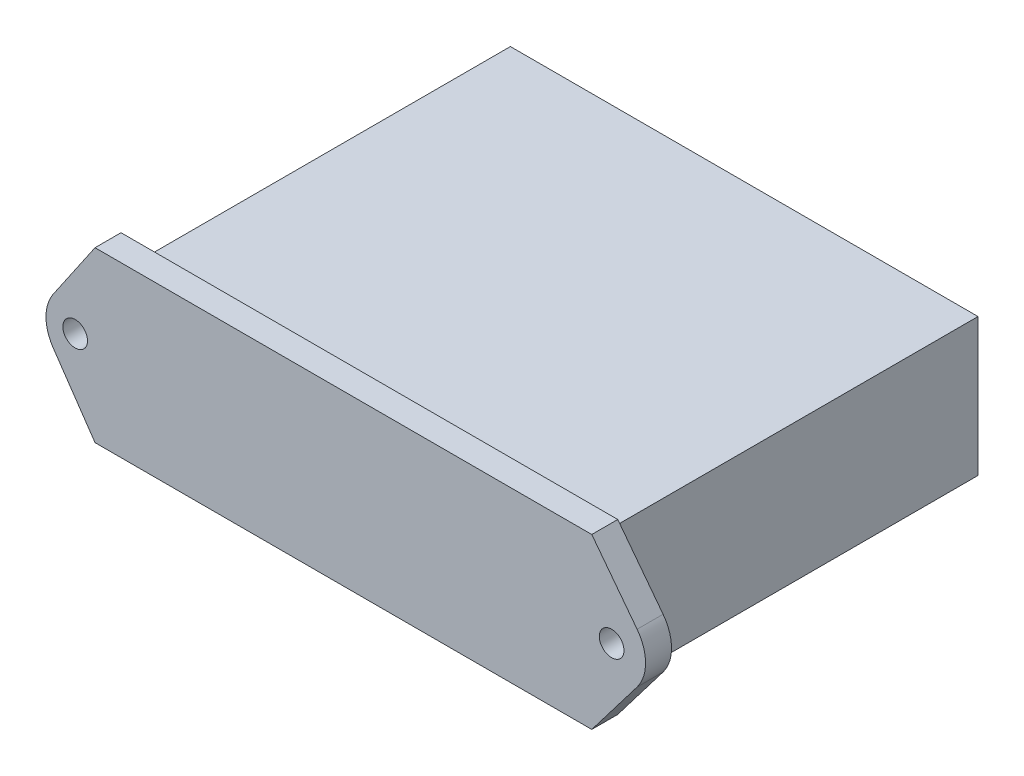
ISO-10303-21;
HEADER;
FILE_DESCRIPTION(('STEP AP214'),'2;1');
FILE_NAME('part.step','',(''),(''),'','','');
FILE_SCHEMA(('AUTOMOTIVE_DESIGN { 1 0 10303 214 1 1 1 1 }'));
ENDSEC;
DATA;
#1=APPLICATION_CONTEXT('core data for automotive mechanical design processes');
#2=APPLICATION_PROTOCOL_DEFINITION('international standard','automotive_design',2000,#1);
#3=PRODUCT_CONTEXT('',#1,'mechanical');
#4=PRODUCT('Part','Part','',(#3));
#5=PRODUCT_RELATED_PRODUCT_CATEGORY('part','',(#4));
#6=PRODUCT_DEFINITION_FORMATION('','',#4);
#7=PRODUCT_DEFINITION_CONTEXT('part definition',#1,'design');
#8=PRODUCT_DEFINITION('design','',#6,#7);
#9=PRODUCT_DEFINITION_SHAPE('','',#8);
#10=(LENGTH_UNIT() NAMED_UNIT(*) SI_UNIT(.MILLI.,.METRE.));
#11=(NAMED_UNIT(*) PLANE_ANGLE_UNIT() SI_UNIT($,.RADIAN.));
#12=(NAMED_UNIT(*) SI_UNIT($,.STERADIAN.) SOLID_ANGLE_UNIT());
#13=UNCERTAINTY_MEASURE_WITH_UNIT(LENGTH_MEASURE(1.E-05),#10,'distance_accuracy_value','');
#14=(GEOMETRIC_REPRESENTATION_CONTEXT(3) GLOBAL_UNCERTAINTY_ASSIGNED_CONTEXT((#13)) GLOBAL_UNIT_ASSIGNED_CONTEXT((#10,
#11,#12)) REPRESENTATION_CONTEXT('',''));
#15=CARTESIAN_POINT('',(0.,0.,0.));
#16=DIRECTION('',(0.,0.,1.));
#17=DIRECTION('',(1.,0.,0.));
#18=AXIS2_PLACEMENT_3D('',#15,#16,#17);
#19=CARTESIAN_POINT('',(0.,21.2,0.));
#20=DIRECTION('',(1.,0.,0.));
#21=DIRECTION('',(0.,0.,-1.));
#22=AXIS2_PLACEMENT_3D('',#19,#20,#21);
#23=PLANE('',#22);
#24=DIRECTION('',(0.,0.,1.));
#25=VECTOR('',#24,1.);
#26=CARTESIAN_POINT('',(0.,0.,0.));
#27=LINE('',#26,#25);
#28=CARTESIAN_POINT('',(0.,0.,-57.1999999999999));
#29=VERTEX_POINT('',#28);
#30=CARTESIAN_POINT('',(0.,0.,0.));
#31=VERTEX_POINT('',#30);
#32=EDGE_CURVE('E141',#29,#31,#27,.T.);
#33=ORIENTED_EDGE('',*,*,#32,.T.);
#34=DIRECTION('',(0.,-1.,0.));
#35=VECTOR('',#34,1.);
#36=CARTESIAN_POINT('',(0.,21.2,0.));
#37=LINE('',#36,#35);
#38=CARTESIAN_POINT('',(0.,21.2,0.));
#39=VERTEX_POINT('',#38);
#40=EDGE_CURVE('E201',#39,#31,#37,.T.);
#41=ORIENTED_EDGE('',*,*,#40,.F.);
#42=DIRECTION('',(0.,0.,1.));
#43=VECTOR('',#42,1.);
#44=CARTESIAN_POINT('',(0.,21.2,0.));
#45=LINE('',#44,#43);
#46=CARTESIAN_POINT('',(0.,21.2,-57.1999999999999));
#47=VERTEX_POINT('',#46);
#48=EDGE_CURVE('E175',#47,#39,#45,.T.);
#49=ORIENTED_EDGE('',*,*,#48,.F.);
#50=DIRECTION('',(0.,-1.,0.));
#51=VECTOR('',#50,1.);
#52=CARTESIAN_POINT('',(0.,21.2,-57.1999999999999));
#53=LINE('',#52,#51);
#54=EDGE_CURVE('E184',#47,#29,#53,.T.);
#55=ORIENTED_EDGE('',*,*,#54,.T.);
#56=EDGE_LOOP('',(#33,#41,#49,#55));
#57=FACE_BOUND('',#56,.T.);
#58=ADVANCED_FACE('F33',(#57),#23,.F.);
#59=CARTESIAN_POINT('',(72.,21.2,0.));
#60=DIRECTION('',(-1.,0.,0.));
#61=DIRECTION('',(0.,0.,1.));
#62=AXIS2_PLACEMENT_3D('',#59,#60,#61);
#63=PLANE('',#62);
#64=DIRECTION('',(0.,0.,-1.));
#65=VECTOR('',#64,1.);
#66=CARTESIAN_POINT('',(72.,0.,0.));
#67=LINE('',#66,#65);
#68=CARTESIAN_POINT('',(72.,0.,0.));
#69=VERTEX_POINT('',#68);
#70=CARTESIAN_POINT('',(72.,0.,-57.2));
#71=VERTEX_POINT('',#70);
#72=EDGE_CURVE('E190',#69,#71,#67,.T.);
#73=ORIENTED_EDGE('',*,*,#72,.T.);
#74=DIRECTION('',(0.,-1.,0.));
#75=VECTOR('',#74,1.);
#76=CARTESIAN_POINT('',(72.,21.2,-57.2));
#77=LINE('',#76,#75);
#78=CARTESIAN_POINT('',(72.,21.2,-57.2));
#79=VERTEX_POINT('',#78);
#80=EDGE_CURVE('E195',#79,#71,#77,.T.);
#81=ORIENTED_EDGE('',*,*,#80,.F.);
#82=DIRECTION('',(0.,0.,-1.));
#83=VECTOR('',#82,1.);
#84=CARTESIAN_POINT('',(72.,21.2,0.));
#85=LINE('',#84,#83);
#86=CARTESIAN_POINT('',(72.,21.2,0.));
#87=VERTEX_POINT('',#86);
#88=EDGE_CURVE('E180',#87,#79,#85,.T.);
#89=ORIENTED_EDGE('',*,*,#88,.F.);
#90=DIRECTION('',(0.,-1.,0.));
#91=VECTOR('',#90,1.);
#92=CARTESIAN_POINT('',(72.,21.2,0.));
#93=LINE('',#92,#91);
#94=EDGE_CURVE('E198',#87,#69,#93,.T.);
#95=ORIENTED_EDGE('',*,*,#94,.T.);
#96=EDGE_LOOP('',(#73,#81,#89,#95));
#97=FACE_BOUND('',#96,.T.);
#98=ADVANCED_FACE('F276',(#97),#63,.F.);
#99=CARTESIAN_POINT('',(0.,21.2,-57.1999999999999));
#100=DIRECTION('',(0.,0.,1.));
#101=DIRECTION('',(1.,0.,0.));
#102=AXIS2_PLACEMENT_3D('',#99,#100,#101);
#103=PLANE('',#102);
#104=DIRECTION('',(-1.,0.,0.));
#105=VECTOR('',#104,1.);
#106=CARTESIAN_POINT('',(0.,0.,-57.1999999999999));
#107=LINE('',#106,#105);
#108=EDGE_CURVE('E178',#71,#29,#107,.T.);
#109=ORIENTED_EDGE('',*,*,#108,.T.);
#110=ORIENTED_EDGE('',*,*,#54,.F.);
#111=DIRECTION('',(-1.,0.,0.));
#112=VECTOR('',#111,1.);
#113=CARTESIAN_POINT('',(0.,21.2,-57.1999999999999));
#114=LINE('',#113,#112);
#115=EDGE_CURVE('E182',#79,#47,#114,.T.);
#116=ORIENTED_EDGE('',*,*,#115,.F.);
#117=ORIENTED_EDGE('',*,*,#80,.T.);
#118=EDGE_LOOP('',(#109,#110,#116,#117));
#119=FACE_BOUND('',#118,.T.);
#120=ADVANCED_FACE('F282',(#119),#103,.F.);
#121=CARTESIAN_POINT('',(0.,21.2,0.));
#122=DIRECTION('',(0.,-1.,0.));
#123=DIRECTION('',(0.,0.,-1.));
#124=AXIS2_PLACEMENT_3D('',#121,#122,#123);
#125=PLANE('',#124);
#126=ORIENTED_EDGE('',*,*,#48,.T.);
#127=DIRECTION('',(1.,0.,0.));
#128=VECTOR('',#127,1.);
#129=CARTESIAN_POINT('',(0.,21.2,0.));
#130=LINE('',#129,#128);
#131=EDGE_CURVE('E177',#39,#87,#130,.T.);
#132=ORIENTED_EDGE('',*,*,#131,.T.);
#133=ORIENTED_EDGE('',*,*,#88,.T.);
#134=ORIENTED_EDGE('',*,*,#115,.T.);
#135=EDGE_LOOP('',(#126,#132,#133,#134));
#136=FACE_BOUND('',#135,.T.);
#137=ADVANCED_FACE('F271',(#136),#125,.F.);
#138=CARTESIAN_POINT('',(0.,0.,0.));
#139=DIRECTION('',(0.,-1.,0.));
#140=DIRECTION('',(0.,0.,-1.));
#141=AXIS2_PLACEMENT_3D('',#138,#139,#140);
#142=PLANE('',#141);
#143=ORIENTED_EDGE('',*,*,#32,.F.);
#144=ORIENTED_EDGE('',*,*,#108,.F.);
#145=ORIENTED_EDGE('',*,*,#72,.F.);
#146=DIRECTION('',(1.,0.,0.));
#147=VECTOR('',#146,1.);
#148=CARTESIAN_POINT('',(0.,0.,0.));
#149=LINE('',#148,#147);
#150=EDGE_CURVE('E187',#31,#69,#149,.T.);
#151=ORIENTED_EDGE('',*,*,#150,.F.);
#152=EDGE_LOOP('',(#143,#144,#145,#151));
#153=FACE_BOUND('',#152,.T.);
#154=ADVANCED_FACE('F263',(#153),#142,.T.);
#155=CARTESIAN_POINT('',(0.,0.,0.));
#156=DIRECTION('',(0.,0.,1.));
#157=DIRECTION('',(1.,0.,0.));
#158=AXIS2_PLACEMENT_3D('',#155,#156,#157);
#159=PLANE('',#158);
#160=CARTESIAN_POINT('',(76.7883970378811,10.6,0.));
#161=DIRECTION('',(0.,0.,1.));
#162=DIRECTION('',(1.,0.,0.));
#163=AXIS2_PLACEMENT_3D('',#160,#161,#162);
#164=CIRCLE('',#163,1.9);
#165=CARTESIAN_POINT('',(78.6883970378811,10.6,0.));
#166=VERTEX_POINT('',#165);
#167=EDGE_CURVE('E240',#166,#166,#164,.T.);
#168=ORIENTED_EDGE('',*,*,#167,.T.);
#169=EDGE_LOOP('',(#168));
#170=FACE_BOUND('',#169,.T.);
#171=CARTESIAN_POINT('',(-5.8116029621189,10.6,0.));
#172=DIRECTION('',(0.,0.,1.));
#173=DIRECTION('',(1.,0.,0.));
#174=AXIS2_PLACEMENT_3D('',#171,#172,#173);
#175=CIRCLE('',#174,1.9);
#176=CARTESIAN_POINT('',(-3.9116029621189,10.6,0.));
#177=VERTEX_POINT('',#176);
#178=EDGE_CURVE('E159',#177,#177,#175,.T.);
#179=ORIENTED_EDGE('',*,*,#178,.T.);
#180=EDGE_LOOP('',(#179));
#181=FACE_BOUND('',#180,.T.);
#182=DIRECTION('',(0.564741802552881,-0.825267651401242,0.));
#183=VECTOR('',#182,1.);
#184=CARTESIAN_POINT('',(-11.65,10.6,0.));
#185=LINE('',#184,#183);
#186=CARTESIAN_POINT('',(-9.19597617620402,7.0138895537892,0.));
#187=VERTEX_POINT('',#186);
#188=CARTESIAN_POINT('',(-2.75392438050625,-2.4,0.));
#189=VERTEX_POINT('',#188);
#190=EDGE_CURVE('E138',#187,#189,#185,.T.);
#191=ORIENTED_EDGE('',*,*,#190,.F.);
#192=CARTESIAN_POINT('',(-3.95552658980613,10.6,0.));
#193=DIRECTION('',(0.,0.,1.));
#194=DIRECTION('',(1.,0.,0.));
#195=AXIS2_PLACEMENT_3D('',#192,#193,#194);
#196=CIRCLE('',#195,6.35);
#197=CARTESIAN_POINT('',(-9.19597617620402,14.1861104462108,0.));
#198=VERTEX_POINT('',#197);
#199=EDGE_CURVE('E208',#187,#198,#196,.F.);
#200=ORIENTED_EDGE('',*,*,#199,.T.);
#201=DIRECTION('',(-0.564741802552881,-0.825267651401242,0.));
#202=VECTOR('',#201,1.);
#203=CARTESIAN_POINT('',(-2.75392438050625,23.6,0.));
#204=LINE('',#203,#202);
#205=CARTESIAN_POINT('',(-2.75392438050625,23.6,0.));
#206=VERTEX_POINT('',#205);
#207=EDGE_CURVE('E156',#206,#198,#204,.T.);
#208=ORIENTED_EDGE('',*,*,#207,.F.);
#209=DIRECTION('',(-1.,0.,0.));
#210=VECTOR('',#209,1.);
#211=CARTESIAN_POINT('',(-2.75392438050625,23.6,0.));
#212=LINE('',#211,#210);
#213=CARTESIAN_POINT('',(73.7307184562684,23.6,0.));
#214=VERTEX_POINT('',#213);
#215=EDGE_CURVE('E167',#214,#206,#212,.T.);
#216=ORIENTED_EDGE('',*,*,#215,.F.);
#217=DIRECTION('',(-0.606604871307083,0.795003478046806,0.));
#218=VECTOR('',#217,1.);
#219=CARTESIAN_POINT('',(73.7307184562684,23.6,0.));
#220=LINE('',#219,#218);
#221=CARTESIAN_POINT('',(80.7108856459795,14.4519409328,0.));
#222=VERTEX_POINT('',#221);
#223=EDGE_CURVE('E165',#222,#214,#220,.T.);
#224=ORIENTED_EDGE('',*,*,#223,.F.);
#225=CARTESIAN_POINT('',(75.6626135603823,10.6,0.));
#226=DIRECTION('',(0.,0.,1.));
#227=DIRECTION('',(1.,0.,0.));
#228=AXIS2_PLACEMENT_3D('',#225,#226,#227);
#229=CIRCLE('',#228,6.35);
#230=CARTESIAN_POINT('',(80.7108856459795,6.74805906720004,0.));
#231=VERTEX_POINT('',#230);
#232=EDGE_CURVE('E206',#222,#231,#229,.F.);
#233=ORIENTED_EDGE('',*,*,#232,.T.);
#234=DIRECTION('',(0.606604871307082,0.795003478046806,0.));
#235=VECTOR('',#234,1.);
#236=CARTESIAN_POINT('',(83.65,10.6,0.));
#237=LINE('',#236,#235);
#238=CARTESIAN_POINT('',(73.7307184562684,-2.4,0.));
#239=VERTEX_POINT('',#238);
#240=EDGE_CURVE('E163',#239,#231,#237,.T.);
#241=ORIENTED_EDGE('',*,*,#240,.F.);
#242=DIRECTION('',(1.,0.,0.));
#243=VECTOR('',#242,1.);
#244=CARTESIAN_POINT('',(-2.75392438050625,-2.4,0.));
#245=LINE('',#244,#243);
#246=EDGE_CURVE('E161',#189,#239,#245,.T.);
#247=ORIENTED_EDGE('',*,*,#246,.F.);
#248=EDGE_LOOP('',(#191,#200,#208,#216,#224,#233,#241,#247));
#249=FACE_BOUND('',#248,.T.);
#250=ORIENTED_EDGE('',*,*,#94,.F.);
#251=ORIENTED_EDGE('',*,*,#131,.F.);
#252=ORIENTED_EDGE('',*,*,#40,.T.);
#253=ORIENTED_EDGE('',*,*,#150,.T.);
#254=EDGE_LOOP('',(#250,#251,#252,#253));
#255=FACE_BOUND('',#254,.T.);
#256=ADVANCED_FACE('F222',(#170,#181,#249,#255),#159,.F.);
#257=CARTESIAN_POINT('',(-2.75392438050625,23.6,4.));
#258=DIRECTION('',(0.825267651401242,-0.564741802552881,0.));
#259=DIRECTION('',(0.564741802552881,0.825267651401242,0.));
#260=AXIS2_PLACEMENT_3D('',#257,#258,#259);
#261=PLANE('',#260);
#262=ORIENTED_EDGE('',*,*,#207,.T.);
#263=DIRECTION('',(0.,0.,-1.));
#264=VECTOR('',#263,1.);
#265=CARTESIAN_POINT('',(-9.19597617620402,14.1861104462108,4.));
#266=LINE('',#265,#264);
#267=CARTESIAN_POINT('',(-9.19597617620402,14.1861104462108,4.));
#268=VERTEX_POINT('',#267);
#269=EDGE_CURVE('E210',#198,#268,#266,.F.);
#270=ORIENTED_EDGE('',*,*,#269,.T.);
#271=DIRECTION('',(-0.564741802552881,-0.825267651401242,0.));
#272=VECTOR('',#271,1.);
#273=CARTESIAN_POINT('',(-2.75392438050625,23.6,4.));
#274=LINE('',#273,#272);
#275=CARTESIAN_POINT('',(-2.75392438050625,23.6,4.));
#276=VERTEX_POINT('',#275);
#277=EDGE_CURVE('E132',#276,#268,#274,.T.);
#278=ORIENTED_EDGE('',*,*,#277,.F.);
#279=DIRECTION('',(0.,0.,-1.));
#280=VECTOR('',#279,1.);
#281=CARTESIAN_POINT('',(-2.75392438050625,23.6,4.));
#282=LINE('',#281,#280);
#283=EDGE_CURVE('E155',#276,#206,#282,.T.);
#284=ORIENTED_EDGE('',*,*,#283,.T.);
#285=EDGE_LOOP('',(#262,#270,#278,#284));
#286=FACE_BOUND('',#285,.T.);
#287=ADVANCED_FACE('F232',(#286),#261,.F.);
#288=CARTESIAN_POINT('',(-11.65,10.6,4.));
#289=DIRECTION('',(0.825267651401242,0.564741802552881,0.));
#290=DIRECTION('',(-0.564741802552881,0.825267651401242,0.));
#291=AXIS2_PLACEMENT_3D('',#288,#289,#290);
#292=PLANE('',#291);
#293=DIRECTION('',(0.564741802552881,-0.825267651401242,0.));
#294=VECTOR('',#293,1.);
#295=CARTESIAN_POINT('',(-11.65,10.6,4.));
#296=LINE('',#295,#294);
#297=CARTESIAN_POINT('',(-9.19597617620402,7.0138895537892,4.));
#298=VERTEX_POINT('',#297);
#299=CARTESIAN_POINT('',(-2.75392438050625,-2.4,4.));
#300=VERTEX_POINT('',#299);
#301=EDGE_CURVE('E120',#298,#300,#296,.T.);
#302=ORIENTED_EDGE('',*,*,#301,.F.);
#303=DIRECTION('',(0.,0.,-1.));
#304=VECTOR('',#303,1.);
#305=CARTESIAN_POINT('',(-9.19597617620402,7.0138895537892,4.));
#306=LINE('',#305,#304);
#307=EDGE_CURVE('E204',#298,#187,#306,.T.);
#308=ORIENTED_EDGE('',*,*,#307,.T.);
#309=ORIENTED_EDGE('',*,*,#190,.T.);
#310=DIRECTION('',(0.,0.,-1.));
#311=VECTOR('',#310,1.);
#312=CARTESIAN_POINT('',(-2.75392438050625,-2.4,4.));
#313=LINE('',#312,#311);
#314=EDGE_CURVE('E135',#300,#189,#313,.T.);
#315=ORIENTED_EDGE('',*,*,#314,.F.);
#316=EDGE_LOOP('',(#302,#308,#309,#315));
#317=FACE_BOUND('',#316,.T.);
#318=ADVANCED_FACE('F136',(#317),#292,.F.);
#319=CARTESIAN_POINT('',(-2.75392438050625,-2.4,4.));
#320=DIRECTION('',(0.,1.,0.));
#321=DIRECTION('',(0.,0.,1.));
#322=AXIS2_PLACEMENT_3D('',#319,#320,#321);
#323=PLANE('',#322);
#324=ORIENTED_EDGE('',*,*,#246,.T.);
#325=DIRECTION('',(0.,0.,-1.));
#326=VECTOR('',#325,1.);
#327=CARTESIAN_POINT('',(73.7307184562684,-2.4,4.));
#328=LINE('',#327,#326);
#329=CARTESIAN_POINT('',(73.7307184562684,-2.4,4.));
#330=VERTEX_POINT('',#329);
#331=EDGE_CURVE('E142',#330,#239,#328,.T.);
#332=ORIENTED_EDGE('',*,*,#331,.F.);
#333=DIRECTION('',(1.,0.,0.));
#334=VECTOR('',#333,1.);
#335=CARTESIAN_POINT('',(-2.75392438050625,-2.4,4.));
#336=LINE('',#335,#334);
#337=EDGE_CURVE('E125',#300,#330,#336,.T.);
#338=ORIENTED_EDGE('',*,*,#337,.F.);
#339=ORIENTED_EDGE('',*,*,#314,.T.);
#340=EDGE_LOOP('',(#324,#332,#338,#339));
#341=FACE_BOUND('',#340,.T.);
#342=ADVANCED_FACE('F144',(#341),#323,.F.);
#343=CARTESIAN_POINT('',(83.65,10.6,4.));
#344=DIRECTION('',(-0.795003478046806,0.606604871307082,0.));
#345=DIRECTION('',(-0.606604871307082,-0.795003478046806,0.));
#346=AXIS2_PLACEMENT_3D('',#343,#344,#345);
#347=PLANE('',#346);
#348=ORIENTED_EDGE('',*,*,#240,.T.);
#349=DIRECTION('',(0.,0.,-1.));
#350=VECTOR('',#349,1.);
#351=CARTESIAN_POINT('',(80.7108856459795,6.74805906720004,4.));
#352=LINE('',#351,#350);
#353=CARTESIAN_POINT('',(80.7108856459795,6.74805906720004,4.));
#354=VERTEX_POINT('',#353);
#355=EDGE_CURVE('E11',#231,#354,#352,.F.);
#356=ORIENTED_EDGE('',*,*,#355,.T.);
#357=DIRECTION('',(0.606604871307082,0.795003478046806,0.));
#358=VECTOR('',#357,1.);
#359=CARTESIAN_POINT('',(83.65,10.6,4.));
#360=LINE('',#359,#358);
#361=EDGE_CURVE('E146',#330,#354,#360,.T.);
#362=ORIENTED_EDGE('',*,*,#361,.F.);
#363=ORIENTED_EDGE('',*,*,#331,.T.);
#364=EDGE_LOOP('',(#348,#356,#362,#363));
#365=FACE_BOUND('',#364,.T.);
#366=ADVANCED_FACE('F291',(#365),#347,.F.);
#367=CARTESIAN_POINT('',(73.7307184562684,23.6,4.));
#368=DIRECTION('',(-0.795003478046806,-0.606604871307083,0.));
#369=DIRECTION('',(0.606604871307083,-0.795003478046806,0.));
#370=AXIS2_PLACEMENT_3D('',#367,#368,#369);
#371=PLANE('',#370);
#372=DIRECTION('',(-0.606604871307083,0.795003478046806,0.));
#373=VECTOR('',#372,1.);
#374=CARTESIAN_POINT('',(73.7307184562684,23.6,4.));
#375=LINE('',#374,#373);
#376=CARTESIAN_POINT('',(80.7108856459795,14.4519409328,4.));
#377=VERTEX_POINT('',#376);
#378=CARTESIAN_POINT('',(73.7307184562684,23.6,4.));
#379=VERTEX_POINT('',#378);
#380=EDGE_CURVE('E148',#377,#379,#375,.T.);
#381=ORIENTED_EDGE('',*,*,#380,.F.);
#382=DIRECTION('',(0.,0.,-1.));
#383=VECTOR('',#382,1.);
#384=CARTESIAN_POINT('',(80.7108856459795,14.4519409328,4.));
#385=LINE('',#384,#383);
#386=EDGE_CURVE('E41',#377,#222,#385,.T.);
#387=ORIENTED_EDGE('',*,*,#386,.T.);
#388=ORIENTED_EDGE('',*,*,#223,.T.);
#389=DIRECTION('',(0.,0.,-1.));
#390=VECTOR('',#389,1.);
#391=CARTESIAN_POINT('',(73.7307184562684,23.6,4.));
#392=LINE('',#391,#390);
#393=EDGE_CURVE('E171',#379,#214,#392,.T.);
#394=ORIENTED_EDGE('',*,*,#393,.F.);
#395=EDGE_LOOP('',(#381,#387,#388,#394));
#396=FACE_BOUND('',#395,.T.);
#397=ADVANCED_FACE('F217',(#396),#371,.F.);
#398=CARTESIAN_POINT('',(-2.75392438050625,23.6,4.));
#399=DIRECTION('',(0.,-1.,0.));
#400=DIRECTION('',(0.,0.,-1.));
#401=AXIS2_PLACEMENT_3D('',#398,#399,#400);
#402=PLANE('',#401);
#403=ORIENTED_EDGE('',*,*,#215,.T.);
#404=ORIENTED_EDGE('',*,*,#283,.F.);
#405=DIRECTION('',(-1.,0.,0.));
#406=VECTOR('',#405,1.);
#407=CARTESIAN_POINT('',(-2.75392438050625,23.6,4.));
#408=LINE('',#407,#406);
#409=EDGE_CURVE('E153',#379,#276,#408,.T.);
#410=ORIENTED_EDGE('',*,*,#409,.F.);
#411=ORIENTED_EDGE('',*,*,#393,.T.);
#412=EDGE_LOOP('',(#403,#404,#410,#411));
#413=FACE_BOUND('',#412,.T.);
#414=ADVANCED_FACE('F228',(#413),#402,.F.);
#415=CARTESIAN_POINT('',(0.,0.,4.));
#416=DIRECTION('',(0.,0.,1.));
#417=DIRECTION('',(1.,0.,0.));
#418=AXIS2_PLACEMENT_3D('',#415,#416,#417);
#419=PLANE('',#418);
#420=CARTESIAN_POINT('',(76.7883970378811,10.6,4.));
#421=DIRECTION('',(0.,0.,1.));
#422=DIRECTION('',(1.,0.,0.));
#423=AXIS2_PLACEMENT_3D('',#420,#421,#422);
#424=CIRCLE('',#423,1.9);
#425=CARTESIAN_POINT('',(78.6883970378811,10.6,4.));
#426=VERTEX_POINT('',#425);
#427=EDGE_CURVE('E243',#426,#426,#424,.T.);
#428=ORIENTED_EDGE('',*,*,#427,.F.);
#429=EDGE_LOOP('',(#428));
#430=FACE_BOUND('',#429,.T.);
#431=CARTESIAN_POINT('',(-5.8116029621189,10.6,4.));
#432=DIRECTION('',(0.,0.,1.));
#433=DIRECTION('',(1.,0.,0.));
#434=AXIS2_PLACEMENT_3D('',#431,#432,#433);
#435=CIRCLE('',#434,1.9);
#436=CARTESIAN_POINT('',(-3.9116029621189,10.6,4.));
#437=VERTEX_POINT('',#436);
#438=EDGE_CURVE('E237',#437,#437,#435,.T.);
#439=ORIENTED_EDGE('',*,*,#438,.F.);
#440=EDGE_LOOP('',(#439));
#441=FACE_BOUND('',#440,.T.);
#442=ORIENTED_EDGE('',*,*,#277,.T.);
#443=CARTESIAN_POINT('',(-3.95552658980613,10.6,4.));
#444=DIRECTION('',(0.,0.,1.));
#445=DIRECTION('',(1.,0.,0.));
#446=AXIS2_PLACEMENT_3D('',#443,#444,#445);
#447=CIRCLE('',#446,6.35);
#448=EDGE_CURVE('E128',#268,#298,#447,.T.);
#449=ORIENTED_EDGE('',*,*,#448,.T.);
#450=ORIENTED_EDGE('',*,*,#301,.T.);
#451=ORIENTED_EDGE('',*,*,#337,.T.);
#452=ORIENTED_EDGE('',*,*,#361,.T.);
#453=CARTESIAN_POINT('',(75.6626135603823,10.6,4.));
#454=DIRECTION('',(0.,0.,1.));
#455=DIRECTION('',(1.,0.,0.));
#456=AXIS2_PLACEMENT_3D('',#453,#454,#455);
#457=CIRCLE('',#456,6.35);
#458=EDGE_CURVE('E48',#354,#377,#457,.T.);
#459=ORIENTED_EDGE('',*,*,#458,.T.);
#460=ORIENTED_EDGE('',*,*,#380,.T.);
#461=ORIENTED_EDGE('',*,*,#409,.T.);
#462=EDGE_LOOP('',(#442,#449,#450,#451,#452,#459,#460,#461));
#463=FACE_BOUND('',#462,.T.);
#464=ADVANCED_FACE('F123',(#430,#441,#463),#419,.T.);
#465=CARTESIAN_POINT('',(-3.95552658980613,10.6,4.));
#466=DIRECTION('',(0.,0.,-1.));
#467=DIRECTION('',(-1.,0.,0.));
#468=AXIS2_PLACEMENT_3D('',#465,#466,#467);
#469=CYLINDRICAL_SURFACE('',#468,6.35);
#470=ORIENTED_EDGE('',*,*,#448,.F.);
#471=ORIENTED_EDGE('',*,*,#269,.F.);
#472=ORIENTED_EDGE('',*,*,#199,.F.);
#473=ORIENTED_EDGE('',*,*,#307,.F.);
#474=EDGE_LOOP('',(#470,#471,#472,#473));
#475=FACE_BOUND('',#474,.T.);
#476=ADVANCED_FACE('F252',(#475),#469,.T.);
#477=CARTESIAN_POINT('',(75.6626135603823,10.6,4.));
#478=DIRECTION('',(0.,0.,-1.));
#479=DIRECTION('',(-1.,0.,0.));
#480=AXIS2_PLACEMENT_3D('',#477,#478,#479);
#481=CYLINDRICAL_SURFACE('',#480,6.35);
#482=ORIENTED_EDGE('',*,*,#458,.F.);
#483=ORIENTED_EDGE('',*,*,#355,.F.);
#484=ORIENTED_EDGE('',*,*,#232,.F.);
#485=ORIENTED_EDGE('',*,*,#386,.F.);
#486=EDGE_LOOP('',(#482,#483,#484,#485));
#487=FACE_BOUND('',#486,.T.);
#488=ADVANCED_FACE('F35',(#487),#481,.T.);
#489=CARTESIAN_POINT('',(-5.8116029621189,10.6,-57.2));
#490=DIRECTION('',(0.,0.,1.));
#491=DIRECTION('',(1.,0.,0.));
#492=AXIS2_PLACEMENT_3D('',#489,#490,#491);
#493=CYLINDRICAL_SURFACE('',#492,1.9);
#494=ORIENTED_EDGE('',*,*,#438,.T.);
#495=EDGE_LOOP('',(#494));
#496=FACE_BOUND('',#495,.T.);
#497=ORIENTED_EDGE('',*,*,#178,.F.);
#498=EDGE_LOOP('',(#497));
#499=FACE_BOUND('',#498,.T.);
#500=ADVANCED_FACE('F256',(#496,#499),#493,.F.);
#501=CARTESIAN_POINT('',(76.7883970378811,10.6,-57.2));
#502=DIRECTION('',(0.,0.,1.));
#503=DIRECTION('',(1.,0.,0.));
#504=AXIS2_PLACEMENT_3D('',#501,#502,#503);
#505=CYLINDRICAL_SURFACE('',#504,1.9);
#506=ORIENTED_EDGE('',*,*,#427,.T.);
#507=EDGE_LOOP('',(#506));
#508=FACE_BOUND('',#507,.T.);
#509=ORIENTED_EDGE('',*,*,#167,.F.);
#510=EDGE_LOOP('',(#509));
#511=FACE_BOUND('',#510,.T.);
#512=ADVANCED_FACE('F247',(#508,#511),#505,.F.);
#513=CLOSED_SHELL('',(#58,#98,#120,#137,#154,#256,#287,#318,#342,#366,#397,#414,#464,#476,#488,
#500,#512));
#514=MANIFOLD_SOLID_BREP('B2',#513);
#515=ADVANCED_BREP_SHAPE_REPRESENTATION('',(#18,#514),#14);
#516=SHAPE_DEFINITION_REPRESENTATION(#9,#515);
ENDSEC;
END-ISO-10303-21;
